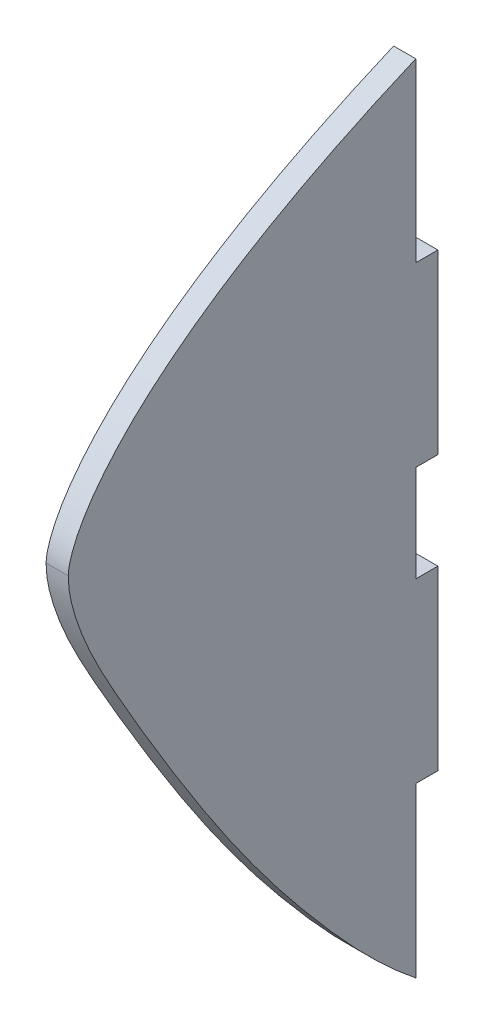
ISO-10303-21;
HEADER;
FILE_DESCRIPTION(('STEP AP214'),'2;1');
FILE_NAME('part.step','',(''),(''),'','','');
FILE_SCHEMA(('AUTOMOTIVE_DESIGN { 1 0 10303 214 1 1 1 1 }'));
ENDSEC;
DATA;
#1=APPLICATION_CONTEXT('core data for automotive mechanical design processes');
#2=APPLICATION_PROTOCOL_DEFINITION('international standard','automotive_design',2000,#1);
#3=PRODUCT_CONTEXT('',#1,'mechanical');
#4=PRODUCT('Part','Part','',(#3));
#5=PRODUCT_RELATED_PRODUCT_CATEGORY('part','',(#4));
#6=PRODUCT_DEFINITION_FORMATION('','',#4);
#7=PRODUCT_DEFINITION_CONTEXT('part definition',#1,'design');
#8=PRODUCT_DEFINITION('design','',#6,#7);
#9=PRODUCT_DEFINITION_SHAPE('','',#8);
#10=(LENGTH_UNIT() NAMED_UNIT(*) SI_UNIT(.MILLI.,.METRE.));
#11=(NAMED_UNIT(*) PLANE_ANGLE_UNIT() SI_UNIT($,.RADIAN.));
#12=(NAMED_UNIT(*) SI_UNIT($,.STERADIAN.) SOLID_ANGLE_UNIT());
#13=UNCERTAINTY_MEASURE_WITH_UNIT(LENGTH_MEASURE(1.E-05),#10,'distance_accuracy_value','');
#14=(GEOMETRIC_REPRESENTATION_CONTEXT(3) GLOBAL_UNCERTAINTY_ASSIGNED_CONTEXT((#13)) GLOBAL_UNIT_ASSIGNED_CONTEXT((#10,
#11,#12)) REPRESENTATION_CONTEXT('',''));
#15=CARTESIAN_POINT('',(0.,0.,0.));
#16=DIRECTION('',(0.,0.,1.));
#17=DIRECTION('',(1.,0.,0.));
#18=AXIS2_PLACEMENT_3D('',#15,#16,#17);
#19=CARTESIAN_POINT('',(34.925,-24.5074572882678,-789.290794794188));
#20=CARTESIAN_POINT('',(34.925,-22.9508793400488,-785.3163619528));
#21=CARTESIAN_POINT('',(34.925,-19.8539671257287,-777.355415120436));
#22=CARTESIAN_POINT('',(34.925,-14.2813303329001,-761.239390145478));
#23=CARTESIAN_POINT('',(34.925,-8.35598015991594,-740.721778453262));
#24=CARTESIAN_POINT('',(34.925,-1.53568956714724,-715.996424383667));
#25=CARTESIAN_POINT('',(34.925,5.03899993633114,-691.207818332634));
#26=CARTESIAN_POINT('',(34.925,11.4508482044253,-666.372578030713));
#27=CARTESIAN_POINT('',(34.925,19.7880426743993,-633.206689035989));
#28=CARTESIAN_POINT('',(34.925,29.787578407225,-591.645313181676));
#29=CARTESIAN_POINT('',(34.925,40.9550752519974,-541.58210338622));
#30=CARTESIAN_POINT('',(34.925,51.0591202019668,-491.296780074609));
#31=CARTESIAN_POINT('',(34.925,59.8424535642073,-440.766917426449));
#32=CARTESIAN_POINT('',(34.925,66.9977719420972,-389.985559505636));
#33=CARTESIAN_POINT('',(34.925,71.3203163709263,-347.467976918165));
#34=CARTESIAN_POINT('',(34.925,73.5458851692162,-313.365437183596));
#35=CARTESIAN_POINT('',(34.925,74.7799936498403,-279.21396421962));
#36=CARTESIAN_POINT('',(34.925,74.5203795449252,-245.029776596433));
#37=CARTESIAN_POINT('',(34.925,72.6538311658042,-210.910406797062));
#38=CARTESIAN_POINT('',(34.925,70.3743923087456,-185.386357323335));
#39=CARTESIAN_POINT('',(34.925,67.2137979677469,-159.955476890662));
#40=CARTESIAN_POINT('',(34.925,63.1156006005303,-134.662571043522));
#41=CARTESIAN_POINT('',(34.925,57.9456674243507,-109.571499581115));
#42=CARTESIAN_POINT('',(34.925,52.5847537322259,-88.9109673754412));
#43=CARTESIAN_POINT('',(34.925,47.5157663270679,-72.6183427392226));
#44=CARTESIAN_POINT('',(34.925,43.2586994140153,-60.554684269467));
#45=CARTESIAN_POINT('',(34.925,38.4699988062142,-48.7006019533348));
#46=CARTESIAN_POINT('',(34.925,33.0526699425482,-37.1258570237104));
#47=CARTESIAN_POINT('',(34.925,27.8818635830338,-27.8301257757577));
#48=CARTESIAN_POINT('',(34.925,23.2421065636616,-20.7190912359694));
#49=CARTESIAN_POINT('',(34.925,19.4551389066012,-15.6144946537095));
#50=CARTESIAN_POINT('',(34.925,15.3220653664984,-10.786662404521));
#51=CARTESIAN_POINT('',(34.925,10.7521230342508,-6.42954257803144));
#52=CARTESIAN_POINT('',(34.925,6.5206529543923,-3.32977957028125));
#53=CARTESIAN_POINT('',(34.925,3.28941724619422,-1.76639239978069));
#54=CARTESIAN_POINT('',(34.925,1.62955284660509,-1.23457798343075));
#55=CARTESIAN_POINT('',(34.925,0.80849642562692,-1.07091571810174));
#56=CARTESIAN_POINT('',(34.925,0.373573946351899,-1.02267814370625));
#57=CARTESIAN_POINT('',(34.925,0.11404070243017,-1.0077713892526));
#58=CARTESIAN_POINT('',(34.925,-0.0105715542451754,-1.00091942828998));
#59=B_SPLINE_CURVE_WITH_KNOTS('',3,(#19,#20,#21,#22,#23,#24,#25,#26,#27,#28,#29,#30,#31,#32,#33,
#34,#35,#36,#37,#38,#39,#40,#41,#42,#43,#44,#45,#46,#47,#48,#49,#50,#51,#52,#53,#54,#55,#56,#57,
#58),.UNSPECIFIED.,.F.,.F.,(4,1,1,1,1,1,1,1,1,1,1,1,1,1,1,1,1,1,1,1,1,1,1,1,1,1,1,1,1,1,1,1,1,1,
1,1,1,4),(0.0158982001693719,0.0312739596805146,0.0466497191916572,0.0774012382139426,
0.108152757236228,0.138904276258513,0.169655795280799,0.200407314303084,0.261910352347655,
0.323413390392225,0.384916428436796,0.446419466481367,0.507922504525938,0.569425542570508,
0.600177061592794,0.630928580615079,0.69243161865965,0.723183137681935,0.75393465670422,
0.784686175726506,0.815437694748791,0.846189213771076,0.876940732793362,0.892316492304504,
0.907692251815647,0.92306801132679,0.938443770837933,0.953819530349075,0.961507410104647,
0.969195289860218,0.976883169615789,0.984571049371361,0.992258929126932,0.996102869004718,
0.99802483894361,0.998985823913057,0.99946631639778,0.999946808882503),.UNSPECIFIED.);
#60=DIRECTION('',(1.,0.,0.));
#61=VECTOR('',#60,1.);
#62=SURFACE_OF_LINEAR_EXTRUSION('',#59,#61);
#63=CARTESIAN_POINT('',(38.1,-24.5074572882678,-789.290794794188));
#64=CARTESIAN_POINT('',(38.1,-22.9508793400488,-785.3163619528));
#65=CARTESIAN_POINT('',(38.1,-19.8539671257287,-777.355415120436));
#66=CARTESIAN_POINT('',(38.1,-14.2813303329001,-761.239390145478));
#67=CARTESIAN_POINT('',(38.1,-8.35598015991594,-740.721778453262));
#68=CARTESIAN_POINT('',(38.1,-1.53568956714724,-715.996424383667));
#69=CARTESIAN_POINT('',(38.1,5.03899993633114,-691.207818332634));
#70=CARTESIAN_POINT('',(38.1,11.4508482044253,-666.372578030713));
#71=CARTESIAN_POINT('',(38.1,19.7880426743993,-633.206689035989));
#72=CARTESIAN_POINT('',(38.1,29.787578407225,-591.645313181676));
#73=CARTESIAN_POINT('',(38.1,40.9550752519974,-541.58210338622));
#74=CARTESIAN_POINT('',(38.1,51.0591202019668,-491.296780074609));
#75=CARTESIAN_POINT('',(38.1,59.8424535642073,-440.766917426449));
#76=CARTESIAN_POINT('',(38.1,66.9977719420972,-389.985559505636));
#77=CARTESIAN_POINT('',(38.1,71.3203163709263,-347.467976918165));
#78=CARTESIAN_POINT('',(38.1,73.5458851692162,-313.365437183596));
#79=CARTESIAN_POINT('',(38.1,74.7799936498403,-279.21396421962));
#80=CARTESIAN_POINT('',(38.1,74.5203795449252,-245.029776596433));
#81=CARTESIAN_POINT('',(38.1,72.6538311658042,-210.910406797062));
#82=CARTESIAN_POINT('',(38.1,70.3743923087456,-185.386357323335));
#83=CARTESIAN_POINT('',(38.1,67.2137979677469,-159.955476890662));
#84=CARTESIAN_POINT('',(38.1,63.1156006005303,-134.662571043522));
#85=CARTESIAN_POINT('',(38.1,57.9456674243507,-109.571499581115));
#86=CARTESIAN_POINT('',(38.1,52.5847537322259,-88.9109673754412));
#87=CARTESIAN_POINT('',(38.1,47.5157663270679,-72.6183427392226));
#88=CARTESIAN_POINT('',(38.1,43.2586994140153,-60.554684269467));
#89=CARTESIAN_POINT('',(38.1,38.4699988062142,-48.7006019533348));
#90=CARTESIAN_POINT('',(38.1,33.0526699425482,-37.1258570237104));
#91=CARTESIAN_POINT('',(38.1,27.8818635830338,-27.8301257757577));
#92=CARTESIAN_POINT('',(38.1,23.2421065636616,-20.7190912359694));
#93=CARTESIAN_POINT('',(38.1,19.4551389066012,-15.6144946537095));
#94=CARTESIAN_POINT('',(38.1,15.3220653664984,-10.786662404521));
#95=CARTESIAN_POINT('',(38.1,10.7521230342508,-6.42954257803144));
#96=CARTESIAN_POINT('',(38.1,6.5206529543923,-3.32977957028125));
#97=CARTESIAN_POINT('',(38.1,3.28941724619422,-1.76639239978069));
#98=CARTESIAN_POINT('',(38.1,1.62955284660509,-1.23457798343075));
#99=CARTESIAN_POINT('',(38.1,0.80849642562692,-1.07091571810174));
#100=CARTESIAN_POINT('',(38.1,0.373573946351899,-1.02267814370625));
#101=CARTESIAN_POINT('',(38.1,0.11404070243017,-1.0077713892526));
#102=CARTESIAN_POINT('',(38.1,-0.0105715542451754,-1.00091942828998));
#103=B_SPLINE_CURVE_WITH_KNOTS('',3,(#63,#64,#65,#66,#67,#68,#69,#70,#71,#72,#73,#74,#75,#76,
#77,#78,#79,#80,#81,#82,#83,#84,#85,#86,#87,#88,#89,#90,#91,#92,#93,#94,#95,#96,#97,#98,#99,
#100,#101,#102),.UNSPECIFIED.,.F.,.F.,(4,1,1,1,1,1,1,1,1,1,1,1,1,1,1,1,1,1,1,1,1,1,1,1,1,1,1,1,
1,1,1,1,1,1,1,1,1,4),(0.0158982001693719,0.0312739596805146,0.0466497191916572,
0.0774012382139426,0.108152757236228,0.138904276258513,0.169655795280799,0.200407314303084,
0.261910352347655,0.323413390392225,0.384916428436796,0.446419466481367,0.507922504525938,
0.569425542570508,0.600177061592794,0.630928580615079,0.69243161865965,0.723183137681935,
0.75393465670422,0.784686175726506,0.815437694748791,0.846189213771076,0.876940732793362,
0.892316492304504,0.907692251815647,0.92306801132679,0.938443770837933,0.953819530349075,
0.961507410104647,0.969195289860218,0.976883169615789,0.984571049371361,0.992258929126932,
0.996102869004718,0.99802483894361,0.998985823913057,0.99946631639778,0.999946808882503),.UNSPECIFIED.);
#104=CARTESIAN_POINT('',(38.1,39.2481231711084,-50.8));
#105=VERTEX_POINT('',#104);
#106=CARTESIAN_POINT('',(38.1,-0.0105715542451754,-1.00091942828998));
#107=VERTEX_POINT('',#106);
#108=EDGE_CURVE('E149',#105,#107,#103,.T.);
#109=ORIENTED_EDGE('',*,*,#108,.F.);
#110=DIRECTION('',(1.,0.,0.));
#111=VECTOR('',#110,1.);
#112=CARTESIAN_POINT('',(34.925,39.2481231711084,-50.8));
#113=LINE('',#112,#111);
#114=CARTESIAN_POINT('',(34.925,39.2481231711084,-50.8));
#115=VERTEX_POINT('',#114);
#116=EDGE_CURVE('E11',#115,#105,#113,.T.);
#117=ORIENTED_EDGE('',*,*,#116,.F.);
#118=CARTESIAN_POINT('',(34.925,-0.0105715542451754,-1.00091942828998));
#119=VERTEX_POINT('',#118);
#120=EDGE_CURVE('E187',#115,#119,#59,.T.);
#121=ORIENTED_EDGE('',*,*,#120,.T.);
#122=DIRECTION('',(1.,0.,0.));
#123=VECTOR('',#122,1.);
#124=CARTESIAN_POINT('',(34.925,-0.0105715542451754,-1.00091942828998));
#125=LINE('',#124,#123);
#126=EDGE_CURVE('E40',#119,#107,#125,.T.);
#127=ORIENTED_EDGE('',*,*,#126,.T.);
#128=EDGE_LOOP('',(#109,#117,#121,#127));
#129=FACE_BOUND('',#128,.T.);
#130=ADVANCED_FACE('F36',(#129),#62,.T.);
#131=CARTESIAN_POINT('',(34.925,0.,-50.8));
#132=DIRECTION('',(0.,0.,-1.));
#133=DIRECTION('',(-1.,0.,0.));
#134=AXIS2_PLACEMENT_3D('',#131,#132,#133);
#135=PLANE('',#134);
#136=DIRECTION('',(0.,1.,0.));
#137=VECTOR('',#136,1.);
#138=CARTESIAN_POINT('',(38.1,0.,-50.8));
#139=LINE('',#138,#137);
#140=CARTESIAN_POINT('',(38.1,13.9346555278244,-50.8));
#141=VERTEX_POINT('',#140);
#142=EDGE_CURVE('E185',#141,#105,#139,.T.);
#143=ORIENTED_EDGE('',*,*,#142,.F.);
#144=DIRECTION('',(1.,0.,0.));
#145=VECTOR('',#144,1.);
#146=CARTESIAN_POINT('',(34.925,13.9346555278244,-50.8));
#147=LINE('',#146,#145);
#148=CARTESIAN_POINT('',(34.925,13.9346555278244,-50.8));
#149=VERTEX_POINT('',#148);
#150=EDGE_CURVE('E46',#149,#141,#147,.T.);
#151=ORIENTED_EDGE('',*,*,#150,.F.);
#152=DIRECTION('',(0.,1.,0.));
#153=VECTOR('',#152,1.);
#154=CARTESIAN_POINT('',(34.925,0.,-50.8));
#155=LINE('',#154,#153);
#156=EDGE_CURVE('E144',#149,#115,#155,.T.);
#157=ORIENTED_EDGE('',*,*,#156,.T.);
#158=ORIENTED_EDGE('',*,*,#116,.T.);
#159=EDGE_LOOP('',(#143,#151,#157,#158));
#160=FACE_BOUND('',#159,.T.);
#161=ADVANCED_FACE('F206',(#160),#135,.T.);
#162=CARTESIAN_POINT('',(34.925,13.9346555278244,0.));
#163=DIRECTION('',(0.,1.,0.));
#164=DIRECTION('',(0.,0.,1.));
#165=AXIS2_PLACEMENT_3D('',#162,#163,#164);
#166=PLANE('',#165);
#167=DIRECTION('',(0.,0.,1.));
#168=VECTOR('',#167,1.);
#169=CARTESIAN_POINT('',(38.1,13.9346555278244,0.));
#170=LINE('',#169,#168);
#171=CARTESIAN_POINT('',(38.1,13.9346555278244,-53.975));
#172=VERTEX_POINT('',#171);
#173=EDGE_CURVE('E130',#172,#141,#170,.T.);
#174=ORIENTED_EDGE('',*,*,#173,.F.);
#175=DIRECTION('',(1.,0.,0.));
#176=VECTOR('',#175,1.);
#177=CARTESIAN_POINT('',(34.925,13.9346555278244,-53.975));
#178=LINE('',#177,#176);
#179=CARTESIAN_POINT('',(34.925,13.9346555278244,-53.975));
#180=VERTEX_POINT('',#179);
#181=EDGE_CURVE('E124',#180,#172,#178,.T.);
#182=ORIENTED_EDGE('',*,*,#181,.F.);
#183=DIRECTION('',(0.,0.,1.));
#184=VECTOR('',#183,1.);
#185=CARTESIAN_POINT('',(34.925,13.9346555278244,0.));
#186=LINE('',#185,#184);
#187=EDGE_CURVE('E128',#180,#149,#186,.T.);
#188=ORIENTED_EDGE('',*,*,#187,.T.);
#189=ORIENTED_EDGE('',*,*,#150,.T.);
#190=EDGE_LOOP('',(#174,#182,#188,#189));
#191=FACE_BOUND('',#190,.T.);
#192=ADVANCED_FACE('F126',(#191),#166,.T.);
#193=CARTESIAN_POINT('',(34.925,0.,-53.975));
#194=DIRECTION('',(0.,0.,1.));
#195=DIRECTION('',(1.,0.,0.));
#196=AXIS2_PLACEMENT_3D('',#193,#194,#195);
#197=PLANE('',#196);
#198=DIRECTION('',(0.,-1.,0.));
#199=VECTOR('',#198,1.);
#200=CARTESIAN_POINT('',(38.1,0.,-53.975));
#201=LINE('',#200,#199);
#202=CARTESIAN_POINT('',(38.1,-11.4653444721756,-53.975));
#203=VERTEX_POINT('',#202);
#204=EDGE_CURVE('E182',#172,#203,#201,.T.);
#205=ORIENTED_EDGE('',*,*,#204,.T.);
#206=DIRECTION('',(1.,0.,0.));
#207=VECTOR('',#206,1.);
#208=CARTESIAN_POINT('',(34.925,-11.4653444721756,-53.975));
#209=LINE('',#208,#207);
#210=CARTESIAN_POINT('',(34.925,-11.4653444721756,-53.975));
#211=VERTEX_POINT('',#210);
#212=EDGE_CURVE('E133',#211,#203,#209,.T.);
#213=ORIENTED_EDGE('',*,*,#212,.F.);
#214=DIRECTION('',(0.,-1.,0.));
#215=VECTOR('',#214,1.);
#216=CARTESIAN_POINT('',(34.925,0.,-53.975));
#217=LINE('',#216,#215);
#218=EDGE_CURVE('E136',#180,#211,#217,.T.);
#219=ORIENTED_EDGE('',*,*,#218,.F.);
#220=ORIENTED_EDGE('',*,*,#181,.T.);
#221=EDGE_LOOP('',(#205,#213,#219,#220));
#222=FACE_BOUND('',#221,.T.);
#223=ADVANCED_FACE('F137',(#222),#197,.F.);
#224=CARTESIAN_POINT('',(34.925,-11.4653444721756,0.));
#225=DIRECTION('',(0.,1.,0.));
#226=DIRECTION('',(0.,0.,1.));
#227=AXIS2_PLACEMENT_3D('',#224,#225,#226);
#228=PLANE('',#227);
#229=DIRECTION('',(0.,0.,1.));
#230=VECTOR('',#229,1.);
#231=CARTESIAN_POINT('',(38.1,-11.4653444721756,0.));
#232=LINE('',#231,#230);
#233=CARTESIAN_POINT('',(38.1,-11.4653444721756,-50.8));
#234=VERTEX_POINT('',#233);
#235=EDGE_CURVE('E179',#203,#234,#232,.T.);
#236=ORIENTED_EDGE('',*,*,#235,.T.);
#237=DIRECTION('',(1.,0.,0.));
#238=VECTOR('',#237,1.);
#239=CARTESIAN_POINT('',(34.925,-11.4653444721756,-50.8));
#240=LINE('',#239,#238);
#241=CARTESIAN_POINT('',(34.925,-11.4653444721756,-50.8));
#242=VERTEX_POINT('',#241);
#243=EDGE_CURVE('E191',#242,#234,#240,.T.);
#244=ORIENTED_EDGE('',*,*,#243,.F.);
#245=DIRECTION('',(0.,0.,1.));
#246=VECTOR('',#245,1.);
#247=CARTESIAN_POINT('',(34.925,-11.4653444721756,0.));
#248=LINE('',#247,#246);
#249=EDGE_CURVE('E141',#211,#242,#248,.T.);
#250=ORIENTED_EDGE('',*,*,#249,.F.);
#251=ORIENTED_EDGE('',*,*,#212,.T.);
#252=EDGE_LOOP('',(#236,#244,#250,#251));
#253=FACE_BOUND('',#252,.T.);
#254=ADVANCED_FACE('F219',(#253),#228,.F.);
#255=CARTESIAN_POINT('',(34.925,0.,-50.8));
#256=DIRECTION('',(0.,0.,-1.));
#257=DIRECTION('',(-1.,0.,0.));
#258=AXIS2_PLACEMENT_3D('',#255,#256,#257);
#259=PLANE('',#258);
#260=DIRECTION('',(0.,1.,0.));
#261=VECTOR('',#260,1.);
#262=CARTESIAN_POINT('',(38.1,0.,-50.8));
#263=LINE('',#262,#261);
#264=CARTESIAN_POINT('',(38.1,-25.2967418560443,-50.8));
#265=VERTEX_POINT('',#264);
#266=EDGE_CURVE('E176',#265,#234,#263,.T.);
#267=ORIENTED_EDGE('',*,*,#266,.F.);
#268=DIRECTION('',(1.,0.,0.));
#269=VECTOR('',#268,1.);
#270=CARTESIAN_POINT('',(34.925,-25.2967418560443,-50.8));
#271=LINE('',#270,#269);
#272=CARTESIAN_POINT('',(34.925,-25.2967418560443,-50.8));
#273=VERTEX_POINT('',#272);
#274=EDGE_CURVE('E193',#273,#265,#271,.T.);
#275=ORIENTED_EDGE('',*,*,#274,.F.);
#276=DIRECTION('',(0.,1.,0.));
#277=VECTOR('',#276,1.);
#278=CARTESIAN_POINT('',(34.925,0.,-50.8));
#279=LINE('',#278,#277);
#280=EDGE_CURVE('E265',#273,#242,#279,.T.);
#281=ORIENTED_EDGE('',*,*,#280,.T.);
#282=ORIENTED_EDGE('',*,*,#243,.T.);
#283=EDGE_LOOP('',(#267,#275,#281,#282));
#284=FACE_BOUND('',#283,.T.);
#285=ADVANCED_FACE('F222',(#284),#259,.T.);
#286=CARTESIAN_POINT('',(34.925,-25.2967418560443,0.));
#287=DIRECTION('',(0.,1.,0.));
#288=DIRECTION('',(0.,0.,1.));
#289=AXIS2_PLACEMENT_3D('',#286,#287,#288);
#290=PLANE('',#289);
#291=DIRECTION('',(0.,0.,1.));
#292=VECTOR('',#291,1.);
#293=CARTESIAN_POINT('',(38.1,-25.2967418560443,0.));
#294=LINE('',#293,#292);
#295=CARTESIAN_POINT('',(38.1,-25.2967418560443,-53.975));
#296=VERTEX_POINT('',#295);
#297=EDGE_CURVE('E173',#296,#265,#294,.T.);
#298=ORIENTED_EDGE('',*,*,#297,.F.);
#299=DIRECTION('',(1.,0.,0.));
#300=VECTOR('',#299,1.);
#301=CARTESIAN_POINT('',(34.925,-25.2967418560443,-53.975));
#302=LINE('',#301,#300);
#303=CARTESIAN_POINT('',(34.925,-25.2967418560443,-53.975));
#304=VERTEX_POINT('',#303);
#305=EDGE_CURVE('E195',#304,#296,#302,.T.);
#306=ORIENTED_EDGE('',*,*,#305,.F.);
#307=DIRECTION('',(0.,0.,1.));
#308=VECTOR('',#307,1.);
#309=CARTESIAN_POINT('',(34.925,-25.2967418560443,0.));
#310=LINE('',#309,#308);
#311=EDGE_CURVE('E262',#304,#273,#310,.T.);
#312=ORIENTED_EDGE('',*,*,#311,.T.);
#313=ORIENTED_EDGE('',*,*,#274,.T.);
#314=EDGE_LOOP('',(#298,#306,#312,#313));
#315=FACE_BOUND('',#314,.T.);
#316=ADVANCED_FACE('F226',(#315),#290,.T.);
#317=CARTESIAN_POINT('',(34.925,0.,-53.975));
#318=DIRECTION('',(0.,0.,1.));
#319=DIRECTION('',(1.,0.,0.));
#320=AXIS2_PLACEMENT_3D('',#317,#318,#319);
#321=PLANE('',#320);
#322=DIRECTION('',(0.,-1.,0.));
#323=VECTOR('',#322,1.);
#324=CARTESIAN_POINT('',(38.1,0.,-53.975));
#325=LINE('',#324,#323);
#326=CARTESIAN_POINT('',(38.1,-50.6967418560443,-53.975));
#327=VERTEX_POINT('',#326);
#328=EDGE_CURVE('E171',#296,#327,#325,.T.);
#329=ORIENTED_EDGE('',*,*,#328,.T.);
#330=DIRECTION('',(1.,0.,0.));
#331=VECTOR('',#330,1.);
#332=CARTESIAN_POINT('',(34.925,-50.6967418560443,-53.975));
#333=LINE('',#332,#331);
#334=CARTESIAN_POINT('',(34.925,-50.6967418560443,-53.975));
#335=VERTEX_POINT('',#334);
#336=EDGE_CURVE('E197',#335,#327,#333,.T.);
#337=ORIENTED_EDGE('',*,*,#336,.F.);
#338=DIRECTION('',(0.,-1.,0.));
#339=VECTOR('',#338,1.);
#340=CARTESIAN_POINT('',(34.925,0.,-53.975));
#341=LINE('',#340,#339);
#342=EDGE_CURVE('E260',#304,#335,#341,.T.);
#343=ORIENTED_EDGE('',*,*,#342,.F.);
#344=ORIENTED_EDGE('',*,*,#305,.T.);
#345=EDGE_LOOP('',(#329,#337,#343,#344));
#346=FACE_BOUND('',#345,.T.);
#347=ADVANCED_FACE('F230',(#346),#321,.F.);
#348=CARTESIAN_POINT('',(34.925,-50.6967418560443,0.));
#349=DIRECTION('',(0.,1.,0.));
#350=DIRECTION('',(0.,0.,1.));
#351=AXIS2_PLACEMENT_3D('',#348,#349,#350);
#352=PLANE('',#351);
#353=DIRECTION('',(0.,0.,1.));
#354=VECTOR('',#353,1.);
#355=CARTESIAN_POINT('',(38.1,-50.6967418560443,0.));
#356=LINE('',#355,#354);
#357=CARTESIAN_POINT('',(38.1,-50.6967418560443,-50.8));
#358=VERTEX_POINT('',#357);
#359=EDGE_CURVE('E168',#327,#358,#356,.T.);
#360=ORIENTED_EDGE('',*,*,#359,.T.);
#361=DIRECTION('',(1.,0.,0.));
#362=VECTOR('',#361,1.);
#363=CARTESIAN_POINT('',(34.925,-50.6967418560443,-50.8));
#364=LINE('',#363,#362);
#365=CARTESIAN_POINT('',(34.925,-50.6967418560443,-50.8));
#366=VERTEX_POINT('',#365);
#367=EDGE_CURVE('E200',#366,#358,#364,.T.);
#368=ORIENTED_EDGE('',*,*,#367,.F.);
#369=DIRECTION('',(0.,0.,1.));
#370=VECTOR('',#369,1.);
#371=CARTESIAN_POINT('',(34.925,-50.6967418560443,0.));
#372=LINE('',#371,#370);
#373=EDGE_CURVE('E258',#335,#366,#372,.T.);
#374=ORIENTED_EDGE('',*,*,#373,.F.);
#375=ORIENTED_EDGE('',*,*,#336,.T.);
#376=EDGE_LOOP('',(#360,#368,#374,#375));
#377=FACE_BOUND('',#376,.T.);
#378=ADVANCED_FACE('F234',(#377),#352,.F.);
#379=CARTESIAN_POINT('',(34.925,0.,-50.8));
#380=DIRECTION('',(0.,0.,-1.));
#381=DIRECTION('',(-1.,0.,0.));
#382=AXIS2_PLACEMENT_3D('',#379,#380,#381);
#383=PLANE('',#382);
#384=DIRECTION('',(0.,1.,0.));
#385=VECTOR('',#384,1.);
#386=CARTESIAN_POINT('',(38.1,0.,-50.8));
#387=LINE('',#386,#385);
#388=CARTESIAN_POINT('',(38.1,-74.8249698286717,-50.8));
#389=VERTEX_POINT('',#388);
#390=EDGE_CURVE('E162',#389,#358,#387,.T.);
#391=ORIENTED_EDGE('',*,*,#390,.F.);
#392=DIRECTION('',(1.,0.,0.));
#393=VECTOR('',#392,1.);
#394=CARTESIAN_POINT('',(34.925,-74.8249698286717,-50.8));
#395=LINE('',#394,#393);
#396=CARTESIAN_POINT('',(34.925,-74.8249698286717,-50.8));
#397=VERTEX_POINT('',#396);
#398=EDGE_CURVE('E201',#397,#389,#395,.T.);
#399=ORIENTED_EDGE('',*,*,#398,.F.);
#400=DIRECTION('',(0.,1.,0.));
#401=VECTOR('',#400,1.);
#402=CARTESIAN_POINT('',(34.925,0.,-50.8));
#403=LINE('',#402,#401);
#404=EDGE_CURVE('E249',#397,#366,#403,.T.);
#405=ORIENTED_EDGE('',*,*,#404,.T.);
#406=ORIENTED_EDGE('',*,*,#367,.T.);
#407=EDGE_LOOP('',(#391,#399,#405,#406));
#408=FACE_BOUND('',#407,.T.);
#409=ADVANCED_FACE('F238',(#408),#383,.T.);
#410=CARTESIAN_POINT('',(34.925,-0.010571554244949,-1.00091942828998));
#411=CARTESIAN_POINT('',(34.925,-0.277884035092403,-1.00992186429154));
#412=CARTESIAN_POINT('',(34.925,-0.823363516528355,-1.02892542519057));
#413=CARTESIAN_POINT('',(34.925,-1.82586056757742,-1.10276659026962));
#414=CARTESIAN_POINT('',(34.925,-3.59720544979579,-1.4167583701592));
#415=CARTESIAN_POINT('',(34.925,-7.2031980141578,-2.45214991226985));
#416=CARTESIAN_POINT('',(34.925,-12.1314475274385,-4.55768908706907));
#417=CARTESIAN_POINT('',(34.925,-17.8738398221117,-7.69425128420263));
#418=CARTESIAN_POINT('',(34.925,-25.4664029849051,-12.0814505739614));
#419=CARTESIAN_POINT('',(34.925,-34.7964723438076,-17.732187966962));
#420=CARTESIAN_POINT('',(34.925,-45.7682269263305,-24.9199180091646));
#421=CARTESIAN_POINT('',(34.925,-54.4810024514933,-31.4576395978099));
#422=CARTESIAN_POINT('',(34.925,-61.1825485276851,-37.0476347276397));
#423=CARTESIAN_POINT('',(34.925,-67.7200389950007,-42.8536104612325));
#424=CARTESIAN_POINT('',(34.925,-75.2474279990914,-50.6544833890105));
#425=CARTESIAN_POINT('',(34.925,-82.3375796283403,-61.6337008298023));
#426=CARTESIAN_POINT('',(34.925,-87.3558320405155,-73.6522350944921));
#427=CARTESIAN_POINT('',(34.925,-90.8757461882615,-86.2831473460429));
#428=CARTESIAN_POINT('',(34.925,-93.5961307876831,-99.0883255351352));
#429=CARTESIAN_POINT('',(34.925,-96.1813002834321,-116.355568341884));
#430=CARTESIAN_POINT('',(34.925,-97.7922976674635,-138.172359339796));
#431=CARTESIAN_POINT('',(34.925,-97.9545698036435,-164.414750871362));
#432=CARTESIAN_POINT('',(34.925,-96.7472514191075,-190.644182857328));
#433=CARTESIAN_POINT('',(34.925,-94.5068033648367,-216.810363835388));
#434=CARTESIAN_POINT('',(34.925,-91.4627744990053,-242.901110379607));
#435=CARTESIAN_POINT('',(34.925,-86.5747829680277,-277.588940898692));
#436=CARTESIAN_POINT('',(34.925,-79.2929568217852,-320.780260554555));
#437=CARTESIAN_POINT('',(34.925,-69.5596595695539,-372.441584722318));
#438=CARTESIAN_POINT('',(34.925,-59.4829281927388,-424.047472781757));
#439=CARTESIAN_POINT('',(34.925,-49.5822384711547,-475.697383860633));
#440=CARTESIAN_POINT('',(34.925,-40.3239611783185,-527.47677911688));
#441=CARTESIAN_POINT('',(34.925,-32.1431436086785,-579.449134828056));
#442=CARTESIAN_POINT('',(34.925,-25.5196834895329,-631.656292139503));
#443=CARTESIAN_POINT('',(34.925,-21.7598239259106,-675.368134105105));
#444=CARTESIAN_POINT('',(34.925,-20.2591998046104,-710.439693759353));
#445=CARTESIAN_POINT('',(34.925,-20.0352627306667,-736.775050872084));
#446=CARTESIAN_POINT('',(34.925,-21.0631816428031,-763.122872794764));
#447=CARTESIAN_POINT('',(34.925,-23.1009908227619,-780.614043856544));
#448=CARTESIAN_POINT('',(34.925,-24.5074572882678,-789.290794794188));
#449=B_SPLINE_CURVE_WITH_KNOTS('',3,(#410,#411,#412,#413,#414,#415,#416,#417,#418,#419,#420,
#421,#422,#423,#424,#425,#426,#427,#428,#429,#430,#431,#432,#433,#434,#435,#436,#437,#438,#439,
#440,#441,#442,#443,#444,#445,#446,#447,#448),.UNSPECIFIED.,.F.,.F.,(4,1,1,1,1,1,1,1,1,1,1,1,1,
1,1,1,1,1,1,1,1,1,1,1,1,1,1,1,1,1,1,1,1,1,1,1,4),(5.17264205865588E-05,0.00101308306119286,
0.00197443970179916,0.00389715298301175,0.00774257954543695,0.0154334326702873,
0.0231242857951377,0.0308151389199881,0.0461968451696889,0.0615785514193897,0.0769602576690904,
0.0846511107939408,0.0923419639187912,0.107723670168492,0.123105376418193,0.138487082667894,
0.153868788917594,0.169250495167295,0.184632201416996,0.215395613916397,0.246159026415799,
0.2769224389152,0.307685851414602,0.338449263914004,0.369212676413405,0.430739501412208,
0.492266326411011,0.553793151409814,0.615319976408617,0.676846801407421,0.738373626406224,
0.799900451405027,0.86142727640383,0.892190688903231,0.922954101402633,0.953717513902035,
0.984480926401436),.UNSPECIFIED.);
#450=DIRECTION('',(1.,0.,0.));
#451=VECTOR('',#450,1.);
#452=SURFACE_OF_LINEAR_EXTRUSION('',#449,#451);
#453=CARTESIAN_POINT('',(38.1,-0.010571554244949,-1.00091942828998));
#454=CARTESIAN_POINT('',(38.1,-0.277884035092403,-1.00992186429154));
#455=CARTESIAN_POINT('',(38.1,-0.823363516528355,-1.02892542519057));
#456=CARTESIAN_POINT('',(38.1,-1.82586056757742,-1.10276659026962));
#457=CARTESIAN_POINT('',(38.1,-3.59720544979579,-1.4167583701592));
#458=CARTESIAN_POINT('',(38.1,-7.2031980141578,-2.45214991226985));
#459=CARTESIAN_POINT('',(38.1,-12.1314475274385,-4.55768908706907));
#460=CARTESIAN_POINT('',(38.1,-17.8738398221117,-7.69425128420263));
#461=CARTESIAN_POINT('',(38.1,-25.4664029849051,-12.0814505739614));
#462=CARTESIAN_POINT('',(38.1,-34.7964723438076,-17.732187966962));
#463=CARTESIAN_POINT('',(38.1,-45.7682269263305,-24.9199180091646));
#464=CARTESIAN_POINT('',(38.1,-54.4810024514933,-31.4576395978099));
#465=CARTESIAN_POINT('',(38.1,-61.1825485276851,-37.0476347276397));
#466=CARTESIAN_POINT('',(38.1,-67.7200389950007,-42.8536104612325));
#467=CARTESIAN_POINT('',(38.1,-75.2474279990914,-50.6544833890105));
#468=CARTESIAN_POINT('',(38.1,-82.3375796283403,-61.6337008298023));
#469=CARTESIAN_POINT('',(38.1,-87.3558320405155,-73.6522350944921));
#470=CARTESIAN_POINT('',(38.1,-90.8757461882615,-86.2831473460429));
#471=CARTESIAN_POINT('',(38.1,-93.5961307876831,-99.0883255351352));
#472=CARTESIAN_POINT('',(38.1,-96.1813002834321,-116.355568341884));
#473=CARTESIAN_POINT('',(38.1,-97.7922976674635,-138.172359339796));
#474=CARTESIAN_POINT('',(38.1,-97.9545698036435,-164.414750871362));
#475=CARTESIAN_POINT('',(38.1,-96.7472514191075,-190.644182857328));
#476=CARTESIAN_POINT('',(38.1,-94.5068033648367,-216.810363835388));
#477=CARTESIAN_POINT('',(38.1,-91.4627744990053,-242.901110379607));
#478=CARTESIAN_POINT('',(38.1,-86.5747829680277,-277.588940898692));
#479=CARTESIAN_POINT('',(38.1,-79.2929568217852,-320.780260554555));
#480=CARTESIAN_POINT('',(38.1,-69.5596595695539,-372.441584722318));
#481=CARTESIAN_POINT('',(38.1,-59.4829281927388,-424.047472781757));
#482=CARTESIAN_POINT('',(38.1,-49.5822384711547,-475.697383860633));
#483=CARTESIAN_POINT('',(38.1,-40.3239611783185,-527.47677911688));
#484=CARTESIAN_POINT('',(38.1,-32.1431436086785,-579.449134828056));
#485=CARTESIAN_POINT('',(38.1,-25.5196834895329,-631.656292139503));
#486=CARTESIAN_POINT('',(38.1,-21.7598239259106,-675.368134105105));
#487=CARTESIAN_POINT('',(38.1,-20.2591998046104,-710.439693759353));
#488=CARTESIAN_POINT('',(38.1,-20.0352627306667,-736.775050872084));
#489=CARTESIAN_POINT('',(38.1,-21.0631816428031,-763.122872794764));
#490=CARTESIAN_POINT('',(38.1,-23.1009908227619,-780.614043856544));
#491=CARTESIAN_POINT('',(38.1,-24.5074572882678,-789.290794794188));
#492=B_SPLINE_CURVE_WITH_KNOTS('',3,(#453,#454,#455,#456,#457,#458,#459,#460,#461,#462,#463,
#464,#465,#466,#467,#468,#469,#470,#471,#472,#473,#474,#475,#476,#477,#478,#479,#480,#481,#482,
#483,#484,#485,#486,#487,#488,#489,#490,#491),.UNSPECIFIED.,.F.,.F.,(4,1,1,1,1,1,1,1,1,1,1,1,1,
1,1,1,1,1,1,1,1,1,1,1,1,1,1,1,1,1,1,1,1,1,1,1,4),(5.17264205865588E-05,0.00101308306119286,
0.00197443970179916,0.00389715298301175,0.00774257954543695,0.0154334326702873,
0.0231242857951377,0.0308151389199881,0.0461968451696889,0.0615785514193897,0.0769602576690904,
0.0846511107939408,0.0923419639187912,0.107723670168492,0.123105376418193,0.138487082667894,
0.153868788917594,0.169250495167295,0.184632201416996,0.215395613916397,0.246159026415799,
0.2769224389152,0.307685851414602,0.338449263914004,0.369212676413405,0.430739501412208,
0.492266326411011,0.553793151409814,0.615319976408617,0.676846801407421,0.738373626406224,
0.799900451405027,0.86142727640383,0.892190688903231,0.922954101402633,0.953717513902035,
0.984480926401436),.UNSPECIFIED.);
#493=EDGE_CURVE('E154',#107,#389,#492,.T.);
#494=ORIENTED_EDGE('',*,*,#493,.F.);
#495=ORIENTED_EDGE('',*,*,#126,.F.);
#496=EDGE_CURVE('E244',#119,#397,#449,.T.);
#497=ORIENTED_EDGE('',*,*,#496,.T.);
#498=ORIENTED_EDGE('',*,*,#398,.T.);
#499=EDGE_LOOP('',(#494,#495,#497,#498));
#500=FACE_BOUND('',#499,.T.);
#501=ADVANCED_FACE('F203',(#500),#452,.T.);
#502=CARTESIAN_POINT('',(34.925,0.,0.));
#503=DIRECTION('',(1.,0.,0.));
#504=DIRECTION('',(0.,0.,-1.));
#505=AXIS2_PLACEMENT_3D('',#502,#503,#504);
#506=PLANE('',#505);
#507=ORIENTED_EDGE('',*,*,#120,.F.);
#508=ORIENTED_EDGE('',*,*,#156,.F.);
#509=ORIENTED_EDGE('',*,*,#187,.F.);
#510=ORIENTED_EDGE('',*,*,#218,.T.);
#511=ORIENTED_EDGE('',*,*,#249,.T.);
#512=ORIENTED_EDGE('',*,*,#280,.F.);
#513=ORIENTED_EDGE('',*,*,#311,.F.);
#514=ORIENTED_EDGE('',*,*,#342,.T.);
#515=ORIENTED_EDGE('',*,*,#373,.T.);
#516=ORIENTED_EDGE('',*,*,#404,.F.);
#517=ORIENTED_EDGE('',*,*,#496,.F.);
#518=EDGE_LOOP('',(#507,#508,#509,#510,#511,#512,#513,#514,#515,#516,#517));
#519=FACE_BOUND('',#518,.T.);
#520=ADVANCED_FACE('F143',(#519),#506,.F.);
#521=CARTESIAN_POINT('',(38.1,0.,0.));
#522=DIRECTION('',(1.,0.,0.));
#523=DIRECTION('',(0.,0.,-1.));
#524=AXIS2_PLACEMENT_3D('',#521,#522,#523);
#525=PLANE('',#524);
#526=ORIENTED_EDGE('',*,*,#108,.T.);
#527=ORIENTED_EDGE('',*,*,#493,.T.);
#528=ORIENTED_EDGE('',*,*,#390,.T.);
#529=ORIENTED_EDGE('',*,*,#359,.F.);
#530=ORIENTED_EDGE('',*,*,#328,.F.);
#531=ORIENTED_EDGE('',*,*,#297,.T.);
#532=ORIENTED_EDGE('',*,*,#266,.T.);
#533=ORIENTED_EDGE('',*,*,#235,.F.);
#534=ORIENTED_EDGE('',*,*,#204,.F.);
#535=ORIENTED_EDGE('',*,*,#173,.T.);
#536=ORIENTED_EDGE('',*,*,#142,.T.);
#537=EDGE_LOOP('',(#526,#527,#528,#529,#530,#531,#532,#533,#534,#535,#536));
#538=FACE_BOUND('',#537,.T.);
#539=ADVANCED_FACE('F205',(#538),#525,.T.);
#540=CLOSED_SHELL('',(#130,#161,#192,#223,#254,#285,#316,#347,#378,#409,#501,#520,#539));
#541=MANIFOLD_SOLID_BREP('B2',#540);
#542=ADVANCED_BREP_SHAPE_REPRESENTATION('',(#18,#541),#14);
#543=SHAPE_DEFINITION_REPRESENTATION(#9,#542);
ENDSEC;
END-ISO-10303-21;
